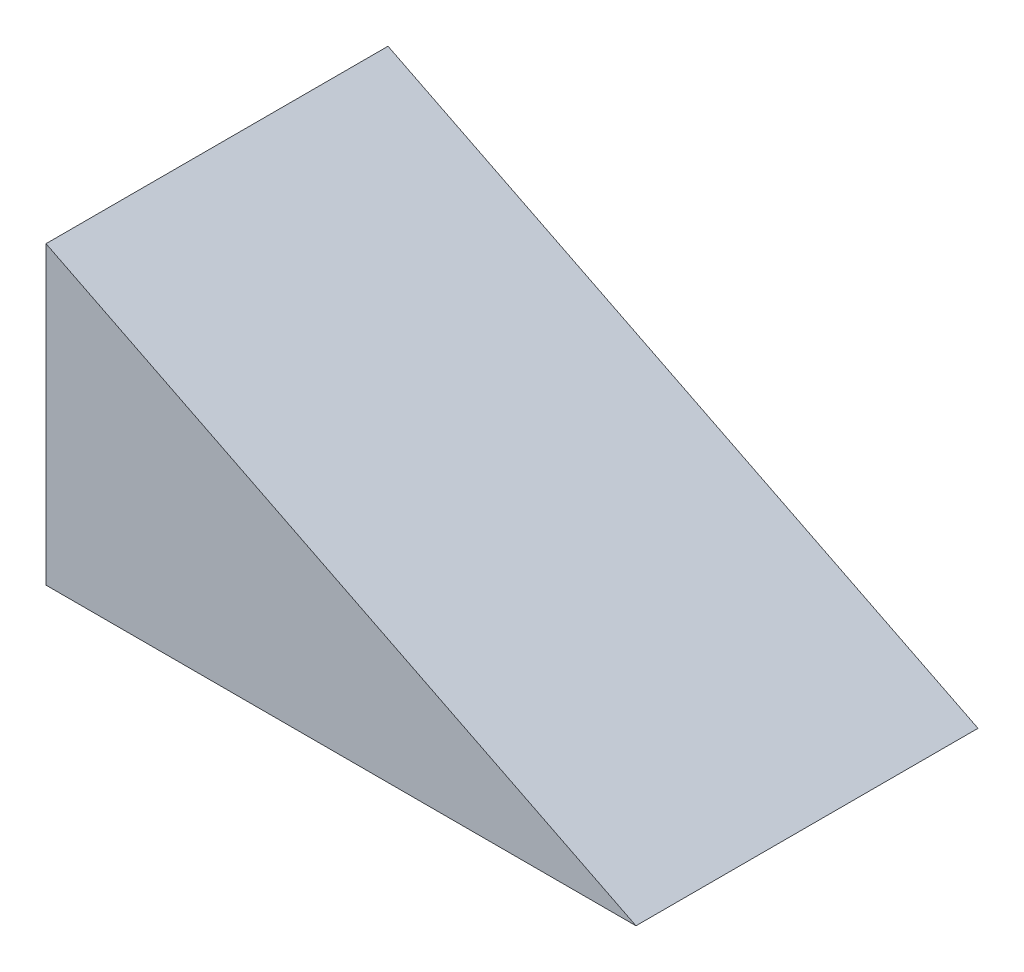
ISO-10303-21;
HEADER;
FILE_DESCRIPTION(('STEP AP214'),'2;1');
FILE_NAME('part.step','',(''),(''),'','','');
FILE_SCHEMA(('AUTOMOTIVE_DESIGN { 1 0 10303 214 1 1 1 1 }'));
ENDSEC;
DATA;
#1=APPLICATION_CONTEXT('core data for automotive mechanical design processes');
#2=APPLICATION_PROTOCOL_DEFINITION('international standard','automotive_design',2000,#1);
#3=PRODUCT_CONTEXT('',#1,'mechanical');
#4=PRODUCT('Part','Part','',(#3));
#5=PRODUCT_RELATED_PRODUCT_CATEGORY('part','',(#4));
#6=PRODUCT_DEFINITION_FORMATION('','',#4);
#7=PRODUCT_DEFINITION_CONTEXT('part definition',#1,'design');
#8=PRODUCT_DEFINITION('design','',#6,#7);
#9=PRODUCT_DEFINITION_SHAPE('','',#8);
#10=(LENGTH_UNIT() NAMED_UNIT(*) SI_UNIT(.MILLI.,.METRE.));
#11=(NAMED_UNIT(*) PLANE_ANGLE_UNIT() SI_UNIT($,.RADIAN.));
#12=(NAMED_UNIT(*) SI_UNIT($,.STERADIAN.) SOLID_ANGLE_UNIT());
#13=UNCERTAINTY_MEASURE_WITH_UNIT(LENGTH_MEASURE(1.E-05),#10,'distance_accuracy_value','');
#14=(GEOMETRIC_REPRESENTATION_CONTEXT(3) GLOBAL_UNCERTAINTY_ASSIGNED_CONTEXT((#13)) GLOBAL_UNIT_ASSIGNED_CONTEXT((#10,
#11,#12)) REPRESENTATION_CONTEXT('',''));
#15=CARTESIAN_POINT('',(0.,0.,0.));
#16=DIRECTION('',(0.,0.,1.));
#17=DIRECTION('',(1.,0.,0.));
#18=AXIS2_PLACEMENT_3D('',#15,#16,#17);
#19=CARTESIAN_POINT('',(1035.,-1.26750943711751E-13,-600.));
#20=DIRECTION('',(0.,-1.,0.));
#21=DIRECTION('',(1.,0.,0.));
#22=AXIS2_PLACEMENT_3D('',#19,#20,#21);
#23=PLANE('',#22);
#24=DIRECTION('',(1.,0.,0.));
#25=VECTOR('',#24,1.);
#26=CARTESIAN_POINT('',(1035.,-1.26750943711751E-13,0.));
#27=LINE('',#26,#25);
#28=CARTESIAN_POINT('',(0.,0.,0.));
#29=VERTEX_POINT('',#28);
#30=CARTESIAN_POINT('',(1035.,-1.26750943711751E-13,0.));
#31=VERTEX_POINT('',#30);
#32=EDGE_CURVE('E87',#29,#31,#27,.T.);
#33=ORIENTED_EDGE('',*,*,#32,.F.);
#34=DIRECTION('',(0.,0.,1.));
#35=VECTOR('',#34,1.);
#36=CARTESIAN_POINT('',(0.,0.,-600.));
#37=LINE('',#36,#35);
#38=CARTESIAN_POINT('',(0.,0.,-600.));
#39=VERTEX_POINT('',#38);
#40=EDGE_CURVE('E11',#39,#29,#37,.T.);
#41=ORIENTED_EDGE('',*,*,#40,.F.);
#42=DIRECTION('',(1.,0.,0.));
#43=VECTOR('',#42,1.);
#44=CARTESIAN_POINT('',(1035.,-1.26750943711751E-13,-600.));
#45=LINE('',#44,#43);
#46=CARTESIAN_POINT('',(1035.,-1.26750943711751E-13,-600.));
#47=VERTEX_POINT('',#46);
#48=EDGE_CURVE('E79',#39,#47,#45,.T.);
#49=ORIENTED_EDGE('',*,*,#48,.T.);
#50=DIRECTION('',(0.,0.,1.));
#51=VECTOR('',#50,1.);
#52=CARTESIAN_POINT('',(1035.,-1.26750943711751E-13,-600.));
#53=LINE('',#52,#51);
#54=EDGE_CURVE('E38',#47,#31,#53,.T.);
#55=ORIENTED_EDGE('',*,*,#54,.T.);
#56=EDGE_LOOP('',(#33,#41,#49,#55));
#57=FACE_BOUND('',#56,.T.);
#58=ADVANCED_FACE('F35',(#57),#23,.T.);
#59=CARTESIAN_POINT('',(0.,0.,-600.));
#60=DIRECTION('',(-1.,0.,0.));
#61=DIRECTION('',(0.,0.,1.));
#62=AXIS2_PLACEMENT_3D('',#59,#60,#61);
#63=PLANE('',#62);
#64=DIRECTION('',(0.,-1.,0.));
#65=VECTOR('',#64,1.);
#66=CARTESIAN_POINT('',(0.,0.,0.));
#67=LINE('',#66,#65);
#68=CARTESIAN_POINT('',(0.,518.79504679,0.));
#69=VERTEX_POINT('',#68);
#70=EDGE_CURVE('E81',#69,#29,#67,.T.);
#71=ORIENTED_EDGE('',*,*,#70,.F.);
#72=DIRECTION('',(0.,0.,1.));
#73=VECTOR('',#72,1.);
#74=CARTESIAN_POINT('',(0.,518.79504679,-600.));
#75=LINE('',#74,#73);
#76=CARTESIAN_POINT('',(0.,518.79504679,-600.));
#77=VERTEX_POINT('',#76);
#78=EDGE_CURVE('E44',#77,#69,#75,.T.);
#79=ORIENTED_EDGE('',*,*,#78,.F.);
#80=DIRECTION('',(0.,-1.,0.));
#81=VECTOR('',#80,1.);
#82=CARTESIAN_POINT('',(0.,0.,-600.));
#83=LINE('',#82,#81);
#84=EDGE_CURVE('E76',#77,#39,#83,.T.);
#85=ORIENTED_EDGE('',*,*,#84,.T.);
#86=ORIENTED_EDGE('',*,*,#40,.T.);
#87=EDGE_LOOP('',(#71,#79,#85,#86));
#88=FACE_BOUND('',#87,.T.);
#89=ADVANCED_FACE('F91',(#88),#63,.T.);
#90=CARTESIAN_POINT('',(0.,518.79504679,-600.));
#91=DIRECTION('',(0.448108247054537,0.893979305645108,0.));
#92=DIRECTION('',(-0.893979305645108,0.448108247054537,0.));
#93=AXIS2_PLACEMENT_3D('',#90,#91,#92);
#94=PLANE('',#93);
#95=DIRECTION('',(-0.893979305645108,0.448108247054537,0.));
#96=VECTOR('',#95,1.);
#97=CARTESIAN_POINT('',(0.,518.79504679,0.));
#98=LINE('',#97,#96);
#99=EDGE_CURVE('E74',#31,#69,#98,.T.);
#100=ORIENTED_EDGE('',*,*,#99,.F.);
#101=ORIENTED_EDGE('',*,*,#54,.F.);
#102=DIRECTION('',(-0.893979305645108,0.448108247054537,0.));
#103=VECTOR('',#102,1.);
#104=CARTESIAN_POINT('',(0.,518.79504679,-600.));
#105=LINE('',#104,#103);
#106=EDGE_CURVE('E72',#47,#77,#105,.T.);
#107=ORIENTED_EDGE('',*,*,#106,.T.);
#108=ORIENTED_EDGE('',*,*,#78,.T.);
#109=EDGE_LOOP('',(#100,#101,#107,#108));
#110=FACE_BOUND('',#109,.T.);
#111=ADVANCED_FACE('F71',(#110),#94,.T.);
#112=CARTESIAN_POINT('',(0.,0.,-600.));
#113=DIRECTION('',(0.,0.,-1.));
#114=DIRECTION('',(-1.,0.,0.));
#115=AXIS2_PLACEMENT_3D('',#112,#113,#114);
#116=PLANE('',#115);
#117=ORIENTED_EDGE('',*,*,#48,.F.);
#118=ORIENTED_EDGE('',*,*,#84,.F.);
#119=ORIENTED_EDGE('',*,*,#106,.F.);
#120=EDGE_LOOP('',(#117,#118,#119));
#121=FACE_BOUND('',#120,.T.);
#122=ADVANCED_FACE('F78',(#121),#116,.T.);
#123=CARTESIAN_POINT('',(0.,0.,0.));
#124=DIRECTION('',(0.,0.,-1.));
#125=DIRECTION('',(-1.,0.,0.));
#126=AXIS2_PLACEMENT_3D('',#123,#124,#125);
#127=PLANE('',#126);
#128=ORIENTED_EDGE('',*,*,#32,.T.);
#129=ORIENTED_EDGE('',*,*,#99,.T.);
#130=ORIENTED_EDGE('',*,*,#70,.T.);
#131=EDGE_LOOP('',(#128,#129,#130));
#132=FACE_BOUND('',#131,.T.);
#133=ADVANCED_FACE('F90',(#132),#127,.F.);
#134=CLOSED_SHELL('',(#58,#89,#111,#122,#133));
#135=MANIFOLD_SOLID_BREP('B2',#134);
#136=ADVANCED_BREP_SHAPE_REPRESENTATION('',(#18,#135),#14);
#137=SHAPE_DEFINITION_REPRESENTATION(#9,#136);
ENDSEC;
END-ISO-10303-21;
